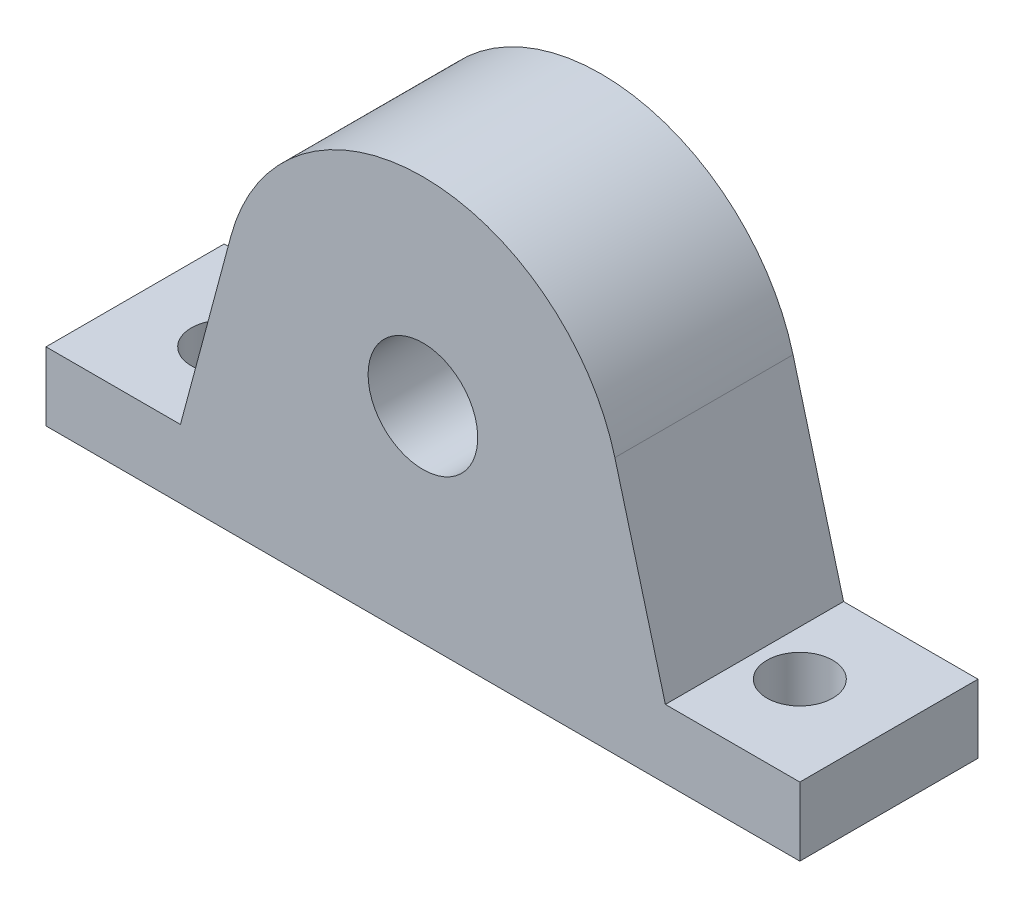
ISO-10303-21;
HEADER;
FILE_DESCRIPTION(('STEP AP214'),'2;1');
FILE_NAME('part.step','',(''),(''),'','','');
FILE_SCHEMA(('AUTOMOTIVE_DESIGN { 1 0 10303 214 1 1 1 1 }'));
ENDSEC;
DATA;
#1=APPLICATION_CONTEXT('core data for automotive mechanical design processes');
#2=APPLICATION_PROTOCOL_DEFINITION('international standard','automotive_design',2000,#1);
#3=PRODUCT_CONTEXT('',#1,'mechanical');
#4=PRODUCT('Part','Part','',(#3));
#5=PRODUCT_RELATED_PRODUCT_CATEGORY('part','',(#4));
#6=PRODUCT_DEFINITION_FORMATION('','',#4);
#7=PRODUCT_DEFINITION_CONTEXT('part definition',#1,'design');
#8=PRODUCT_DEFINITION('design','',#6,#7);
#9=PRODUCT_DEFINITION_SHAPE('','',#8);
#10=(LENGTH_UNIT() NAMED_UNIT(*) SI_UNIT(.MILLI.,.METRE.));
#11=(NAMED_UNIT(*) PLANE_ANGLE_UNIT() SI_UNIT($,.RADIAN.));
#12=(NAMED_UNIT(*) SI_UNIT($,.STERADIAN.) SOLID_ANGLE_UNIT());
#13=UNCERTAINTY_MEASURE_WITH_UNIT(LENGTH_MEASURE(1.E-05),#10,'distance_accuracy_value','');
#14=(GEOMETRIC_REPRESENTATION_CONTEXT(3) GLOBAL_UNCERTAINTY_ASSIGNED_CONTEXT((#13)) GLOBAL_UNIT_ASSIGNED_CONTEXT((#10,
#11,#12)) REPRESENTATION_CONTEXT('',''));
#15=CARTESIAN_POINT('',(0.,0.,0.));
#16=DIRECTION('',(0.,0.,1.));
#17=DIRECTION('',(1.,0.,0.));
#18=AXIS2_PLACEMENT_3D('',#15,#16,#17);
#19=CARTESIAN_POINT('',(0.,15.,6.5));
#20=DIRECTION('',(0.,0.,1.));
#21=DIRECTION('',(1.,0.,0.));
#22=AXIS2_PLACEMENT_3D('',#19,#20,#21);
#23=PLANE('',#22);
#24=DIRECTION('',(0.,-1.,0.));
#25=VECTOR('',#24,1.);
#26=CARTESIAN_POINT('',(-27.5,5.,6.5));
#27=LINE('',#26,#25);
#28=CARTESIAN_POINT('',(-27.5,5.,6.5));
#29=VERTEX_POINT('',#28);
#30=CARTESIAN_POINT('',(-27.5,0.,6.5));
#31=VERTEX_POINT('',#30);
#32=EDGE_CURVE('E152',#29,#31,#27,.T.);
#33=ORIENTED_EDGE('',*,*,#32,.T.);
#34=DIRECTION('',(1.,0.,0.));
#35=VECTOR('',#34,1.);
#36=CARTESIAN_POINT('',(-27.5,0.,6.5));
#37=LINE('',#36,#35);
#38=CARTESIAN_POINT('',(27.5,0.,6.5));
#39=VERTEX_POINT('',#38);
#40=EDGE_CURVE('E100',#31,#39,#37,.T.);
#41=ORIENTED_EDGE('',*,*,#40,.T.);
#42=DIRECTION('',(0.,1.,0.));
#43=VECTOR('',#42,1.);
#44=CARTESIAN_POINT('',(27.5,0.,6.5));
#45=LINE('',#44,#43);
#46=CARTESIAN_POINT('',(27.5,5.00000000000001,6.5));
#47=VERTEX_POINT('',#46);
#48=EDGE_CURVE('E167',#39,#47,#45,.T.);
#49=ORIENTED_EDGE('',*,*,#48,.T.);
#50=DIRECTION('',(-1.,0.,0.));
#51=VECTOR('',#50,1.);
#52=CARTESIAN_POINT('',(27.5,5.00000000000001,6.5));
#53=LINE('',#52,#51);
#54=CARTESIAN_POINT('',(17.6909965402574,5.,6.5));
#55=VERTEX_POINT('',#54);
#56=EDGE_CURVE('E180',#47,#55,#53,.T.);
#57=ORIENTED_EDGE('',*,*,#56,.T.);
#58=DIRECTION('',(-0.258819045102521,0.965925826289068,0.));
#59=VECTOR('',#58,1.);
#60=CARTESIAN_POINT('',(14.0059244811915,18.7528761539866,6.5));
#61=LINE('',#60,#59);
#62=CARTESIAN_POINT('',(14.0059244811915,18.7528761539866,6.5));
#63=VERTEX_POINT('',#62);
#64=EDGE_CURVE('E119',#55,#63,#61,.T.);
#65=ORIENTED_EDGE('',*,*,#64,.T.);
#66=CARTESIAN_POINT('',(0.,15.,6.5));
#67=DIRECTION('',(0.,0.,1.));
#68=DIRECTION('',(1.,0.,0.));
#69=AXIS2_PLACEMENT_3D('',#66,#67,#68);
#70=CIRCLE('',#69,14.5);
#71=CARTESIAN_POINT('',(-14.0059244811915,18.7528761539866,6.5));
#72=VERTEX_POINT('',#71);
#73=EDGE_CURVE('E113',#63,#72,#70,.T.);
#74=ORIENTED_EDGE('',*,*,#73,.T.);
#75=DIRECTION('',(-0.258819045102521,-0.965925826289068,0.));
#76=VECTOR('',#75,1.);
#77=CARTESIAN_POINT('',(-14.0059244811915,18.7528761539866,6.5));
#78=LINE('',#77,#76);
#79=CARTESIAN_POINT('',(-17.6909965402574,5.,6.5));
#80=VERTEX_POINT('',#79);
#81=EDGE_CURVE('E117',#72,#80,#78,.T.);
#82=ORIENTED_EDGE('',*,*,#81,.T.);
#83=DIRECTION('',(-1.,0.,0.));
#84=VECTOR('',#83,1.);
#85=CARTESIAN_POINT('',(-17.6909965402574,5.,6.5));
#86=LINE('',#85,#84);
#87=EDGE_CURVE('E57',#80,#29,#86,.T.);
#88=ORIENTED_EDGE('',*,*,#87,.T.);
#89=EDGE_LOOP('',(#33,#41,#49,#57,#65,#74,#82,#88));
#90=FACE_BOUND('',#89,.T.);
#91=CARTESIAN_POINT('',(0.,15.,6.5));
#92=DIRECTION('',(0.,0.,1.));
#93=DIRECTION('',(1.,0.,0.));
#94=AXIS2_PLACEMENT_3D('',#91,#92,#93);
#95=CIRCLE('',#94,4.);
#96=CARTESIAN_POINT('',(-4.,15.,6.5));
#97=VERTEX_POINT('',#96);
#98=EDGE_CURVE('E141',#97,#97,#95,.T.);
#99=ORIENTED_EDGE('',*,*,#98,.F.);
#100=EDGE_LOOP('',(#99));
#101=FACE_BOUND('',#100,.T.);
#102=ADVANCED_FACE('F40',(#90,#101),#23,.T.);
#103=CARTESIAN_POINT('',(0.,15.,-6.5));
#104=DIRECTION('',(0.,0.,1.));
#105=DIRECTION('',(1.,0.,0.));
#106=AXIS2_PLACEMENT_3D('',#103,#104,#105);
#107=PLANE('',#106);
#108=DIRECTION('',(0.,-1.,0.));
#109=VECTOR('',#108,1.);
#110=CARTESIAN_POINT('',(-27.5,5.,-6.5));
#111=LINE('',#110,#109);
#112=CARTESIAN_POINT('',(-27.5,5.,-6.5));
#113=VERTEX_POINT('',#112);
#114=CARTESIAN_POINT('',(-27.5,0.,-6.5));
#115=VERTEX_POINT('',#114);
#116=EDGE_CURVE('E137',#113,#115,#111,.T.);
#117=ORIENTED_EDGE('',*,*,#116,.F.);
#118=DIRECTION('',(-1.,0.,0.));
#119=VECTOR('',#118,1.);
#120=CARTESIAN_POINT('',(-17.6909965402574,5.,-6.5));
#121=LINE('',#120,#119);
#122=CARTESIAN_POINT('',(-17.6909965402574,5.,-6.5));
#123=VERTEX_POINT('',#122);
#124=EDGE_CURVE('E92',#123,#113,#121,.T.);
#125=ORIENTED_EDGE('',*,*,#124,.F.);
#126=DIRECTION('',(-0.258819045102521,-0.965925826289068,0.));
#127=VECTOR('',#126,1.);
#128=CARTESIAN_POINT('',(-14.0059244811915,18.7528761539866,-6.5));
#129=LINE('',#128,#127);
#130=CARTESIAN_POINT('',(-14.0059244811915,18.7528761539866,-6.5));
#131=VERTEX_POINT('',#130);
#132=EDGE_CURVE('E86',#131,#123,#129,.T.);
#133=ORIENTED_EDGE('',*,*,#132,.F.);
#134=CARTESIAN_POINT('',(0.,15.,-6.5));
#135=DIRECTION('',(0.,0.,1.));
#136=DIRECTION('',(1.,0.,0.));
#137=AXIS2_PLACEMENT_3D('',#134,#135,#136);
#138=CIRCLE('',#137,14.5);
#139=CARTESIAN_POINT('',(14.0059244811915,18.7528761539866,-6.5));
#140=VERTEX_POINT('',#139);
#141=EDGE_CURVE('E127',#140,#131,#138,.T.);
#142=ORIENTED_EDGE('',*,*,#141,.F.);
#143=DIRECTION('',(-0.258819045102521,0.965925826289068,0.));
#144=VECTOR('',#143,1.);
#145=CARTESIAN_POINT('',(14.0059244811915,18.7528761539866,-6.5));
#146=LINE('',#145,#144);
#147=CARTESIAN_POINT('',(17.6909965402574,5.,-6.5));
#148=VERTEX_POINT('',#147);
#149=EDGE_CURVE('E147',#148,#140,#146,.T.);
#150=ORIENTED_EDGE('',*,*,#149,.F.);
#151=DIRECTION('',(-1.,0.,0.));
#152=VECTOR('',#151,1.);
#153=CARTESIAN_POINT('',(27.5,5.00000000000001,-6.5));
#154=LINE('',#153,#152);
#155=CARTESIAN_POINT('',(27.5,5.00000000000001,-6.5));
#156=VERTEX_POINT('',#155);
#157=EDGE_CURVE('E145',#156,#148,#154,.T.);
#158=ORIENTED_EDGE('',*,*,#157,.F.);
#159=DIRECTION('',(0.,1.,0.));
#160=VECTOR('',#159,1.);
#161=CARTESIAN_POINT('',(27.5,0.,-6.5));
#162=LINE('',#161,#160);
#163=CARTESIAN_POINT('',(27.5,0.,-6.5));
#164=VERTEX_POINT('',#163);
#165=EDGE_CURVE('E143',#164,#156,#162,.T.);
#166=ORIENTED_EDGE('',*,*,#165,.F.);
#167=DIRECTION('',(1.,0.,0.));
#168=VECTOR('',#167,1.);
#169=CARTESIAN_POINT('',(-27.5,0.,-6.5));
#170=LINE('',#169,#168);
#171=EDGE_CURVE('E140',#115,#164,#170,.T.);
#172=ORIENTED_EDGE('',*,*,#171,.F.);
#173=EDGE_LOOP('',(#117,#125,#133,#142,#150,#158,#166,#172));
#174=FACE_BOUND('',#173,.T.);
#175=CARTESIAN_POINT('',(0.,15.,-6.5));
#176=DIRECTION('',(0.,0.,1.));
#177=DIRECTION('',(1.,0.,0.));
#178=AXIS2_PLACEMENT_3D('',#175,#176,#177);
#179=CIRCLE('',#178,4.);
#180=CARTESIAN_POINT('',(-4.,15.,-6.5));
#181=VERTEX_POINT('',#180);
#182=EDGE_CURVE('E186',#181,#181,#179,.T.);
#183=ORIENTED_EDGE('',*,*,#182,.T.);
#184=EDGE_LOOP('',(#183));
#185=FACE_BOUND('',#184,.T.);
#186=ADVANCED_FACE('F171',(#174,#185),#107,.F.);
#187=CARTESIAN_POINT('',(-27.5,5.,6.5));
#188=DIRECTION('',(1.,0.,0.));
#189=DIRECTION('',(0.,0.,-1.));
#190=AXIS2_PLACEMENT_3D('',#187,#188,#189);
#191=PLANE('',#190);
#192=ORIENTED_EDGE('',*,*,#116,.T.);
#193=DIRECTION('',(0.,0.,-1.));
#194=VECTOR('',#193,1.);
#195=CARTESIAN_POINT('',(-27.5,0.,6.5));
#196=LINE('',#195,#194);
#197=EDGE_CURVE('E11',#31,#115,#196,.T.);
#198=ORIENTED_EDGE('',*,*,#197,.F.);
#199=ORIENTED_EDGE('',*,*,#32,.F.);
#200=DIRECTION('',(0.,0.,-1.));
#201=VECTOR('',#200,1.);
#202=CARTESIAN_POINT('',(-27.5,5.,6.5));
#203=LINE('',#202,#201);
#204=EDGE_CURVE('E133',#29,#113,#203,.T.);
#205=ORIENTED_EDGE('',*,*,#204,.T.);
#206=EDGE_LOOP('',(#192,#198,#199,#205));
#207=FACE_BOUND('',#206,.T.);
#208=ADVANCED_FACE('F42',(#207),#191,.F.);
#209=CARTESIAN_POINT('',(-27.5,0.,6.5));
#210=DIRECTION('',(0.,1.,0.));
#211=DIRECTION('',(-1.,0.,0.));
#212=AXIS2_PLACEMENT_3D('',#209,#210,#211);
#213=PLANE('',#212);
#214=CARTESIAN_POINT('',(-21.,0.,0.));
#215=DIRECTION('',(0.,1.,0.));
#216=DIRECTION('',(-1.,0.,0.));
#217=AXIS2_PLACEMENT_3D('',#214,#215,#216);
#218=CIRCLE('',#217,2.4);
#219=CARTESIAN_POINT('',(-23.4,0.,0.));
#220=VERTEX_POINT('',#219);
#221=EDGE_CURVE('E194',#220,#220,#218,.T.);
#222=ORIENTED_EDGE('',*,*,#221,.T.);
#223=EDGE_LOOP('',(#222));
#224=FACE_BOUND('',#223,.T.);
#225=CARTESIAN_POINT('',(21.,0.,0.));
#226=DIRECTION('',(0.,1.,0.));
#227=DIRECTION('',(-1.,0.,0.));
#228=AXIS2_PLACEMENT_3D('',#225,#226,#227);
#229=CIRCLE('',#228,2.4);
#230=CARTESIAN_POINT('',(18.6,0.,0.));
#231=VERTEX_POINT('',#230);
#232=EDGE_CURVE('E189',#231,#231,#229,.T.);
#233=ORIENTED_EDGE('',*,*,#232,.T.);
#234=EDGE_LOOP('',(#233));
#235=FACE_BOUND('',#234,.T.);
#236=ORIENTED_EDGE('',*,*,#171,.T.);
#237=DIRECTION('',(0.,0.,-1.));
#238=VECTOR('',#237,1.);
#239=CARTESIAN_POINT('',(27.5,0.,6.5));
#240=LINE('',#239,#238);
#241=EDGE_CURVE('E49',#39,#164,#240,.T.);
#242=ORIENTED_EDGE('',*,*,#241,.F.);
#243=ORIENTED_EDGE('',*,*,#40,.F.);
#244=ORIENTED_EDGE('',*,*,#197,.T.);
#245=EDGE_LOOP('',(#236,#242,#243,#244));
#246=FACE_BOUND('',#245,.T.);
#247=ADVANCED_FACE('F303',(#224,#235,#246),#213,.F.);
#248=CARTESIAN_POINT('',(27.5,0.,6.5));
#249=DIRECTION('',(-1.,0.,0.));
#250=DIRECTION('',(0.,0.,1.));
#251=AXIS2_PLACEMENT_3D('',#248,#249,#250);
#252=PLANE('',#251);
#253=ORIENTED_EDGE('',*,*,#165,.T.);
#254=DIRECTION('',(0.,0.,-1.));
#255=VECTOR('',#254,1.);
#256=CARTESIAN_POINT('',(27.5,5.00000000000001,6.5));
#257=LINE('',#256,#255);
#258=EDGE_CURVE('E159',#47,#156,#257,.T.);
#259=ORIENTED_EDGE('',*,*,#258,.F.);
#260=ORIENTED_EDGE('',*,*,#48,.F.);
#261=ORIENTED_EDGE('',*,*,#241,.T.);
#262=EDGE_LOOP('',(#253,#259,#260,#261));
#263=FACE_BOUND('',#262,.T.);
#264=ADVANCED_FACE('F165',(#263),#252,.F.);
#265=CARTESIAN_POINT('',(27.5,5.00000000000001,6.5));
#266=DIRECTION('',(0.,-1.,0.));
#267=DIRECTION('',(1.,0.,0.));
#268=AXIS2_PLACEMENT_3D('',#265,#266,#267);
#269=PLANE('',#268);
#270=CARTESIAN_POINT('',(21.,5.00000000000002,0.));
#271=DIRECTION('',(0.,1.,0.));
#272=DIRECTION('',(1.,0.,0.));
#273=AXIS2_PLACEMENT_3D('',#270,#271,#272);
#274=CIRCLE('',#273,2.4);
#275=CARTESIAN_POINT('',(18.6,5.00000000000002,0.));
#276=VERTEX_POINT('',#275);
#277=EDGE_CURVE('E198',#276,#276,#274,.T.);
#278=ORIENTED_EDGE('',*,*,#277,.F.);
#279=EDGE_LOOP('',(#278));
#280=FACE_BOUND('',#279,.T.);
#281=ORIENTED_EDGE('',*,*,#157,.T.);
#282=DIRECTION('',(0.,0.,-1.));
#283=VECTOR('',#282,1.);
#284=CARTESIAN_POINT('',(17.6909965402574,5.,6.5));
#285=LINE('',#284,#283);
#286=EDGE_CURVE('E156',#55,#148,#285,.T.);
#287=ORIENTED_EDGE('',*,*,#286,.F.);
#288=ORIENTED_EDGE('',*,*,#56,.F.);
#289=ORIENTED_EDGE('',*,*,#258,.T.);
#290=EDGE_LOOP('',(#281,#287,#288,#289));
#291=FACE_BOUND('',#290,.T.);
#292=ADVANCED_FACE('F176',(#280,#291),#269,.F.);
#293=CARTESIAN_POINT('',(14.0059244811915,18.7528761539866,6.5));
#294=DIRECTION('',(-0.965925826289068,-0.258819045102521,0.));
#295=DIRECTION('',(0.258819045102521,-0.965925826289068,0.));
#296=AXIS2_PLACEMENT_3D('',#293,#294,#295);
#297=PLANE('',#296);
#298=ORIENTED_EDGE('',*,*,#149,.T.);
#299=DIRECTION('',(0.,0.,-1.));
#300=VECTOR('',#299,1.);
#301=CARTESIAN_POINT('',(14.0059244811915,18.7528761539866,6.5));
#302=LINE('',#301,#300);
#303=EDGE_CURVE('E128',#63,#140,#302,.T.);
#304=ORIENTED_EDGE('',*,*,#303,.F.);
#305=ORIENTED_EDGE('',*,*,#64,.F.);
#306=ORIENTED_EDGE('',*,*,#286,.T.);
#307=EDGE_LOOP('',(#298,#304,#305,#306));
#308=FACE_BOUND('',#307,.T.);
#309=ADVANCED_FACE('F179',(#308),#297,.F.);
#310=CARTESIAN_POINT('',(0.,15.,6.5));
#311=DIRECTION('',(0.,0.,-1.));
#312=DIRECTION('',(-1.,0.,0.));
#313=AXIS2_PLACEMENT_3D('',#310,#311,#312);
#314=CYLINDRICAL_SURFACE('',#313,14.5);
#315=ORIENTED_EDGE('',*,*,#141,.T.);
#316=DIRECTION('',(0.,0.,-1.));
#317=VECTOR('',#316,1.);
#318=CARTESIAN_POINT('',(-14.0059244811915,18.7528761539866,6.5));
#319=LINE('',#318,#317);
#320=EDGE_CURVE('E124',#72,#131,#319,.T.);
#321=ORIENTED_EDGE('',*,*,#320,.F.);
#322=ORIENTED_EDGE('',*,*,#73,.F.);
#323=ORIENTED_EDGE('',*,*,#303,.T.);
#324=EDGE_LOOP('',(#315,#321,#322,#323));
#325=FACE_BOUND('',#324,.T.);
#326=ADVANCED_FACE('F125',(#325),#314,.T.);
#327=CARTESIAN_POINT('',(-14.0059244811915,18.7528761539866,6.5));
#328=DIRECTION('',(0.965925826289068,-0.258819045102521,0.));
#329=DIRECTION('',(0.258819045102521,0.965925826289068,0.));
#330=AXIS2_PLACEMENT_3D('',#327,#328,#329);
#331=PLANE('',#330);
#332=ORIENTED_EDGE('',*,*,#132,.T.);
#333=DIRECTION('',(0.,0.,-1.));
#334=VECTOR('',#333,1.);
#335=CARTESIAN_POINT('',(-17.6909965402574,5.,6.5));
#336=LINE('',#335,#334);
#337=EDGE_CURVE('E129',#80,#123,#336,.T.);
#338=ORIENTED_EDGE('',*,*,#337,.F.);
#339=ORIENTED_EDGE('',*,*,#81,.F.);
#340=ORIENTED_EDGE('',*,*,#320,.T.);
#341=EDGE_LOOP('',(#332,#338,#339,#340));
#342=FACE_BOUND('',#341,.T.);
#343=ADVANCED_FACE('F131',(#342),#331,.F.);
#344=CARTESIAN_POINT('',(-17.6909965402574,5.,6.5));
#345=DIRECTION('',(0.,-1.,0.));
#346=DIRECTION('',(1.,0.,0.));
#347=AXIS2_PLACEMENT_3D('',#344,#345,#346);
#348=PLANE('',#347);
#349=CARTESIAN_POINT('',(-21.,5.,0.));
#350=DIRECTION('',(0.,1.,0.));
#351=DIRECTION('',(-1.,0.,0.));
#352=AXIS2_PLACEMENT_3D('',#349,#350,#351);
#353=CIRCLE('',#352,2.4);
#354=CARTESIAN_POINT('',(-23.4,5.,0.));
#355=VERTEX_POINT('',#354);
#356=EDGE_CURVE('E197',#355,#355,#353,.T.);
#357=ORIENTED_EDGE('',*,*,#356,.F.);
#358=EDGE_LOOP('',(#357));
#359=FACE_BOUND('',#358,.T.);
#360=ORIENTED_EDGE('',*,*,#124,.T.);
#361=ORIENTED_EDGE('',*,*,#204,.F.);
#362=ORIENTED_EDGE('',*,*,#87,.F.);
#363=ORIENTED_EDGE('',*,*,#337,.T.);
#364=EDGE_LOOP('',(#360,#361,#362,#363));
#365=FACE_BOUND('',#364,.T.);
#366=ADVANCED_FACE('F207',(#359,#365),#348,.F.);
#367=CARTESIAN_POINT('',(0.,15.,6.5));
#368=DIRECTION('',(0.,0.,-1.));
#369=DIRECTION('',(-1.,0.,0.));
#370=AXIS2_PLACEMENT_3D('',#367,#368,#369);
#371=CYLINDRICAL_SURFACE('',#370,4.);
#372=CARTESIAN_POINT('',(-4.,15.,6.5));
#373=CARTESIAN_POINT('',(-4.,15.,6.36458333333333));
#374=CARTESIAN_POINT('',(-4.,15.,6.22916666666667));
#375=CARTESIAN_POINT('',(-4.,15.,5.95833333333333));
#376=CARTESIAN_POINT('',(-4.,15.,5.82291666666667));
#377=CARTESIAN_POINT('',(-4.,15.,5.55208333333333));
#378=CARTESIAN_POINT('',(-4.,15.,5.41666666666667));
#379=CARTESIAN_POINT('',(-4.,15.,5.14583333333333));
#380=CARTESIAN_POINT('',(-4.,15.,5.01041666666667));
#381=CARTESIAN_POINT('',(-4.,15.,4.73958333333333));
#382=CARTESIAN_POINT('',(-4.,15.,4.60416666666667));
#383=CARTESIAN_POINT('',(-4.,15.,4.33333333333333));
#384=CARTESIAN_POINT('',(-4.,15.,4.19791666666667));
#385=CARTESIAN_POINT('',(-4.,15.,3.92708333333333));
#386=CARTESIAN_POINT('',(-4.,15.,3.79166666666667));
#387=CARTESIAN_POINT('',(-4.,15.,3.52083333333333));
#388=CARTESIAN_POINT('',(-4.,15.,3.38541666666667));
#389=CARTESIAN_POINT('',(-4.,15.,3.11458333333333));
#390=CARTESIAN_POINT('',(-4.,15.,2.97916666666667));
#391=CARTESIAN_POINT('',(-4.,15.,2.70833333333333));
#392=CARTESIAN_POINT('',(-4.,15.,2.57291666666667));
#393=CARTESIAN_POINT('',(-4.,15.,2.30208333333333));
#394=CARTESIAN_POINT('',(-4.,15.,2.16666666666667));
#395=CARTESIAN_POINT('',(-4.,15.,1.89583333333333));
#396=CARTESIAN_POINT('',(-4.,15.,1.76041666666667));
#397=CARTESIAN_POINT('',(-4.,15.,1.48958333333333));
#398=CARTESIAN_POINT('',(-4.,15.,1.35416666666667));
#399=CARTESIAN_POINT('',(-4.,15.,1.08333333333333));
#400=CARTESIAN_POINT('',(-4.,15.,0.947916666666666));
#401=CARTESIAN_POINT('',(-4.,15.,0.677083333333332));
#402=CARTESIAN_POINT('',(-4.,15.,0.541666666666666));
#403=CARTESIAN_POINT('',(-4.,15.,0.270833333333333));
#404=CARTESIAN_POINT('',(-4.,15.,0.135416666666666));
#405=CARTESIAN_POINT('',(-4.,15.,-0.135416666666668));
#406=CARTESIAN_POINT('',(-4.,15.,-0.270833333333334));
#407=CARTESIAN_POINT('',(-4.,15.,-0.541666666666668));
#408=CARTESIAN_POINT('',(-4.,15.,-0.677083333333334));
#409=CARTESIAN_POINT('',(-4.,15.,-0.947916666666667));
#410=CARTESIAN_POINT('',(-4.,15.,-1.08333333333333));
#411=CARTESIAN_POINT('',(-4.,15.,-1.35416666666667));
#412=CARTESIAN_POINT('',(-4.,15.,-1.48958333333333));
#413=CARTESIAN_POINT('',(-4.,15.,-1.76041666666667));
#414=CARTESIAN_POINT('',(-4.,15.,-1.89583333333333));
#415=CARTESIAN_POINT('',(-4.,15.,-2.16666666666667));
#416=CARTESIAN_POINT('',(-4.,15.,-2.30208333333333));
#417=CARTESIAN_POINT('',(-4.,15.,-2.57291666666667));
#418=CARTESIAN_POINT('',(-4.,15.,-2.70833333333333));
#419=CARTESIAN_POINT('',(-4.,15.,-2.97916666666667));
#420=CARTESIAN_POINT('',(-4.,15.,-3.11458333333333));
#421=CARTESIAN_POINT('',(-4.,15.,-3.38541666666667));
#422=CARTESIAN_POINT('',(-4.,15.,-3.52083333333333));
#423=CARTESIAN_POINT('',(-4.,15.,-3.79166666666667));
#424=CARTESIAN_POINT('',(-4.,15.,-3.92708333333333));
#425=CARTESIAN_POINT('',(-4.,15.,-4.19791666666667));
#426=CARTESIAN_POINT('',(-4.,15.,-4.33333333333333));
#427=CARTESIAN_POINT('',(-4.,15.,-4.60416666666667));
#428=CARTESIAN_POINT('',(-4.,15.,-4.73958333333333));
#429=CARTESIAN_POINT('',(-4.,15.,-5.01041666666667));
#430=CARTESIAN_POINT('',(-4.,15.,-5.14583333333333));
#431=CARTESIAN_POINT('',(-4.,15.,-5.41666666666667));
#432=CARTESIAN_POINT('',(-4.,15.,-5.55208333333333));
#433=CARTESIAN_POINT('',(-4.,15.,-5.82291666666667));
#434=CARTESIAN_POINT('',(-4.,15.,-5.95833333333333));
#435=CARTESIAN_POINT('',(-4.,15.,-6.22916666666667));
#436=CARTESIAN_POINT('',(-4.,15.,-6.36458333333333));
#437=CARTESIAN_POINT('',(-4.,15.,-6.5));
#438=B_SPLINE_CURVE_WITH_KNOTS('',3,(#372,#373,#374,#375,#376,#377,#378,#379,#380,#381,#382,
#383,#384,#385,#386,#387,#388,#389,#390,#391,#392,#393,#394,#395,#396,#397,#398,#399,#400,#401,
#402,#403,#404,#405,#406,#407,#408,#409,#410,#411,#412,#413,#414,#415,#416,#417,#418,#419,#420,
#421,#422,#423,#424,#425,#426,#427,#428,#429,#430,#431,#432,#433,#434,#435,#436,#437),
.UNSPECIFIED.,.F.,.F.,(4,2,2,2,2,2,2,2,2,2,2,2,2,2,2,2,2,2,2,2,2,2,2,2,2,2,2,2,2,2,2,2,4),(0.,
0.40625,0.8125,1.21875,1.625,2.03125,2.4375,2.84375,3.25,3.65625,4.0625,4.46875,4.875,5.28125,
5.6875,6.09375,6.5,6.90625,7.3125,7.71875,8.125,8.53125,8.9375,9.34375,9.75,10.15625,10.5625,
10.96875,11.375,11.78125,12.1875,12.59375,13.),.UNSPECIFIED.);
#439=EDGE_CURVE('BSEAM209',#97,#181,#438,.T.);
#440=ORIENTED_EDGE('',*,*,#98,.T.);
#441=ORIENTED_EDGE('',*,*,#182,.F.);
#442=ORIENTED_EDGE('',*,*,#439,.T.);
#443=ORIENTED_EDGE('',*,*,#439,.F.);
#444=EDGE_LOOP('',(#440,#442,#441,#443));
#445=FACE_BOUND('',#444,.T.);
#446=ADVANCED_FACE('F209',(#445),#371,.F.);
#447=CARTESIAN_POINT('',(-21.,-8.,0.));
#448=DIRECTION('',(0.,1.,0.));
#449=DIRECTION('',(-1.,0.,0.));
#450=AXIS2_PLACEMENT_3D('',#447,#448,#449);
#451=CYLINDRICAL_SURFACE('',#450,2.4);
#452=CARTESIAN_POINT('',(-23.4,5.,0.));
#453=CARTESIAN_POINT('',(-23.4,4.94791666666667,0.));
#454=CARTESIAN_POINT('',(-23.4,4.89583333333333,0.));
#455=CARTESIAN_POINT('',(-23.4,4.79166666666667,0.));
#456=CARTESIAN_POINT('',(-23.4,4.73958333333333,0.));
#457=CARTESIAN_POINT('',(-23.4,4.63541666666667,0.));
#458=CARTESIAN_POINT('',(-23.4,4.58333333333333,0.));
#459=CARTESIAN_POINT('',(-23.4,4.47916666666667,0.));
#460=CARTESIAN_POINT('',(-23.4,4.42708333333333,0.));
#461=CARTESIAN_POINT('',(-23.4,4.32291666666667,0.));
#462=CARTESIAN_POINT('',(-23.4,4.27083333333333,0.));
#463=CARTESIAN_POINT('',(-23.4,4.16666666666667,0.));
#464=CARTESIAN_POINT('',(-23.4,4.11458333333333,0.));
#465=CARTESIAN_POINT('',(-23.4,4.01041666666667,0.));
#466=CARTESIAN_POINT('',(-23.4,3.95833333333333,0.));
#467=CARTESIAN_POINT('',(-23.4,3.85416666666667,0.));
#468=CARTESIAN_POINT('',(-23.4,3.80208333333333,0.));
#469=CARTESIAN_POINT('',(-23.4,3.69791666666667,0.));
#470=CARTESIAN_POINT('',(-23.4,3.64583333333333,0.));
#471=CARTESIAN_POINT('',(-23.4,3.54166666666667,0.));
#472=CARTESIAN_POINT('',(-23.4,3.48958333333333,0.));
#473=CARTESIAN_POINT('',(-23.4,3.38541666666667,0.));
#474=CARTESIAN_POINT('',(-23.4,3.33333333333333,0.));
#475=CARTESIAN_POINT('',(-23.4,3.22916666666667,0.));
#476=CARTESIAN_POINT('',(-23.4,3.17708333333333,0.));
#477=CARTESIAN_POINT('',(-23.4,3.07291666666667,0.));
#478=CARTESIAN_POINT('',(-23.4,3.02083333333333,0.));
#479=CARTESIAN_POINT('',(-23.4,2.91666666666667,0.));
#480=CARTESIAN_POINT('',(-23.4,2.86458333333333,0.));
#481=CARTESIAN_POINT('',(-23.4,2.76041666666667,0.));
#482=CARTESIAN_POINT('',(-23.4,2.70833333333333,0.));
#483=CARTESIAN_POINT('',(-23.4,2.60416666666667,0.));
#484=CARTESIAN_POINT('',(-23.4,2.55208333333333,0.));
#485=CARTESIAN_POINT('',(-23.4,2.44791666666667,0.));
#486=CARTESIAN_POINT('',(-23.4,2.39583333333333,0.));
#487=CARTESIAN_POINT('',(-23.4,2.29166666666667,0.));
#488=CARTESIAN_POINT('',(-23.4,2.23958333333333,0.));
#489=CARTESIAN_POINT('',(-23.4,2.13541666666667,0.));
#490=CARTESIAN_POINT('',(-23.4,2.08333333333333,0.));
#491=CARTESIAN_POINT('',(-23.4,1.97916666666667,0.));
#492=CARTESIAN_POINT('',(-23.4,1.92708333333333,0.));
#493=CARTESIAN_POINT('',(-23.4,1.82291666666667,0.));
#494=CARTESIAN_POINT('',(-23.4,1.77083333333333,0.));
#495=CARTESIAN_POINT('',(-23.4,1.66666666666667,0.));
#496=CARTESIAN_POINT('',(-23.4,1.61458333333333,0.));
#497=CARTESIAN_POINT('',(-23.4,1.51041666666667,0.));
#498=CARTESIAN_POINT('',(-23.4,1.45833333333333,0.));
#499=CARTESIAN_POINT('',(-23.4,1.35416666666667,0.));
#500=CARTESIAN_POINT('',(-23.4,1.30208333333333,0.));
#501=CARTESIAN_POINT('',(-23.4,1.19791666666667,0.));
#502=CARTESIAN_POINT('',(-23.4,1.14583333333333,0.));
#503=CARTESIAN_POINT('',(-23.4,1.04166666666667,0.));
#504=CARTESIAN_POINT('',(-23.4,0.989583333333334,0.));
#505=CARTESIAN_POINT('',(-23.4,0.885416666666668,0.));
#506=CARTESIAN_POINT('',(-23.4,0.833333333333334,0.));
#507=CARTESIAN_POINT('',(-23.4,0.729166666666667,0.));
#508=CARTESIAN_POINT('',(-23.4,0.677083333333334,0.));
#509=CARTESIAN_POINT('',(-23.4,0.572916666666667,0.));
#510=CARTESIAN_POINT('',(-23.4,0.520833333333334,0.));
#511=CARTESIAN_POINT('',(-23.4,0.416666666666667,0.));
#512=CARTESIAN_POINT('',(-23.4,0.364583333333334,0.));
#513=CARTESIAN_POINT('',(-23.4,0.260416666666667,0.));
#514=CARTESIAN_POINT('',(-23.4,0.208333333333333,0.));
#515=CARTESIAN_POINT('',(-23.4,0.104166666666667,0.));
#516=CARTESIAN_POINT('',(-23.4,0.0520833333333334,0.));
#517=CARTESIAN_POINT('',(-23.4,0.,0.));
#518=B_SPLINE_CURVE_WITH_KNOTS('',3,(#452,#453,#454,#455,#456,#457,#458,#459,#460,#461,#462,
#463,#464,#465,#466,#467,#468,#469,#470,#471,#472,#473,#474,#475,#476,#477,#478,#479,#480,#481,
#482,#483,#484,#485,#486,#487,#488,#489,#490,#491,#492,#493,#494,#495,#496,#497,#498,#499,#500,
#501,#502,#503,#504,#505,#506,#507,#508,#509,#510,#511,#512,#513,#514,#515,#516,#517),
.UNSPECIFIED.,.F.,.F.,(4,2,2,2,2,2,2,2,2,2,2,2,2,2,2,2,2,2,2,2,2,2,2,2,2,2,2,2,2,2,2,2,4),(0.,
0.15625,0.3125,0.46875,0.625000000000001,0.781250000000001,0.937500000000001,1.09375,1.25,
1.40625,1.5625,1.71875,1.875,2.03125,2.1875,2.34375,2.5,2.65625,2.8125,2.96875,3.125,3.28125,
3.4375,3.59375,3.75,3.90625,4.0625,4.21875,4.375,4.53125,4.6875,4.84375,5.),.UNSPECIFIED.);
#519=EDGE_CURVE('BSEAM204',#355,#220,#518,.T.);
#520=ORIENTED_EDGE('',*,*,#356,.T.);
#521=ORIENTED_EDGE('',*,*,#221,.F.);
#522=ORIENTED_EDGE('',*,*,#519,.T.);
#523=ORIENTED_EDGE('',*,*,#519,.F.);
#524=EDGE_LOOP('',(#520,#522,#521,#523));
#525=FACE_BOUND('',#524,.T.);
#526=ADVANCED_FACE('F204',(#525),#451,.F.);
#527=CARTESIAN_POINT('',(21.,-7.99999999999998,0.));
#528=DIRECTION('',(0.,1.,0.));
#529=DIRECTION('',(-1.,0.,0.));
#530=AXIS2_PLACEMENT_3D('',#527,#528,#529);
#531=CYLINDRICAL_SURFACE('',#530,2.4);
#532=CARTESIAN_POINT('',(18.6,5.00000000000002,0.));
#533=CARTESIAN_POINT('',(18.6,4.94791666666669,0.));
#534=CARTESIAN_POINT('',(18.6,4.89583333333335,0.));
#535=CARTESIAN_POINT('',(18.6,4.79166666666669,0.));
#536=CARTESIAN_POINT('',(18.6,4.73958333333335,0.));
#537=CARTESIAN_POINT('',(18.6,4.63541666666669,0.));
#538=CARTESIAN_POINT('',(18.6,4.58333333333335,0.));
#539=CARTESIAN_POINT('',(18.6,4.47916666666668,0.));
#540=CARTESIAN_POINT('',(18.6,4.42708333333335,0.));
#541=CARTESIAN_POINT('',(18.6,4.32291666666668,0.));
#542=CARTESIAN_POINT('',(18.6,4.27083333333335,0.));
#543=CARTESIAN_POINT('',(18.6,4.16666666666668,0.));
#544=CARTESIAN_POINT('',(18.6,4.11458333333335,0.));
#545=CARTESIAN_POINT('',(18.6,4.01041666666668,0.));
#546=CARTESIAN_POINT('',(18.6,3.95833333333335,0.));
#547=CARTESIAN_POINT('',(18.6,3.85416666666668,0.));
#548=CARTESIAN_POINT('',(18.6,3.80208333333335,0.));
#549=CARTESIAN_POINT('',(18.6,3.69791666666668,0.));
#550=CARTESIAN_POINT('',(18.6,3.64583333333335,0.));
#551=CARTESIAN_POINT('',(18.6,3.54166666666668,0.));
#552=CARTESIAN_POINT('',(18.6,3.48958333333335,0.));
#553=CARTESIAN_POINT('',(18.6,3.38541666666668,0.));
#554=CARTESIAN_POINT('',(18.6,3.33333333333335,0.));
#555=CARTESIAN_POINT('',(18.6,3.22916666666668,0.));
#556=CARTESIAN_POINT('',(18.6,3.17708333333335,0.));
#557=CARTESIAN_POINT('',(18.6,3.07291666666668,0.));
#558=CARTESIAN_POINT('',(18.6,3.02083333333335,0.));
#559=CARTESIAN_POINT('',(18.6,2.91666666666668,0.));
#560=CARTESIAN_POINT('',(18.6,2.86458333333335,0.));
#561=CARTESIAN_POINT('',(18.6,2.76041666666668,0.));
#562=CARTESIAN_POINT('',(18.6,2.70833333333335,0.));
#563=CARTESIAN_POINT('',(18.6,2.60416666666668,0.));
#564=CARTESIAN_POINT('',(18.6,2.55208333333335,0.));
#565=CARTESIAN_POINT('',(18.6,2.44791666666668,0.));
#566=CARTESIAN_POINT('',(18.6,2.39583333333335,0.));
#567=CARTESIAN_POINT('',(18.6,2.29166666666668,0.));
#568=CARTESIAN_POINT('',(18.6,2.23958333333334,0.));
#569=CARTESIAN_POINT('',(18.6,2.13541666666668,0.));
#570=CARTESIAN_POINT('',(18.6,2.08333333333334,0.));
#571=CARTESIAN_POINT('',(18.6,1.97916666666668,0.));
#572=CARTESIAN_POINT('',(18.6,1.92708333333334,0.));
#573=CARTESIAN_POINT('',(18.6,1.82291666666668,0.));
#574=CARTESIAN_POINT('',(18.6,1.77083333333334,0.));
#575=CARTESIAN_POINT('',(18.6,1.66666666666668,0.));
#576=CARTESIAN_POINT('',(18.6,1.61458333333334,0.));
#577=CARTESIAN_POINT('',(18.6,1.51041666666668,0.));
#578=CARTESIAN_POINT('',(18.6,1.45833333333334,0.));
#579=CARTESIAN_POINT('',(18.6,1.35416666666668,0.));
#580=CARTESIAN_POINT('',(18.6,1.30208333333334,0.));
#581=CARTESIAN_POINT('',(18.6,1.19791666666668,0.));
#582=CARTESIAN_POINT('',(18.6,1.14583333333334,0.));
#583=CARTESIAN_POINT('',(18.6,1.04166666666668,0.));
#584=CARTESIAN_POINT('',(18.6,0.989583333333342,0.));
#585=CARTESIAN_POINT('',(18.6,0.885416666666674,0.));
#586=CARTESIAN_POINT('',(18.6,0.833333333333341,0.));
#587=CARTESIAN_POINT('',(18.6,0.729166666666674,0.));
#588=CARTESIAN_POINT('',(18.6,0.677083333333341,0.));
#589=CARTESIAN_POINT('',(18.6,0.572916666666674,0.));
#590=CARTESIAN_POINT('',(18.6,0.52083333333334,0.));
#591=CARTESIAN_POINT('',(18.6,0.416666666666672,0.));
#592=CARTESIAN_POINT('',(18.6,0.364583333333339,0.));
#593=CARTESIAN_POINT('',(18.6,0.260416666666672,0.));
#594=CARTESIAN_POINT('',(18.6,0.208333333333339,0.));
#595=CARTESIAN_POINT('',(18.6,0.104166666666672,0.));
#596=CARTESIAN_POINT('',(18.6,0.0520833333333386,0.));
#597=CARTESIAN_POINT('',(18.6,0.,0.));
#598=B_SPLINE_CURVE_WITH_KNOTS('',3,(#532,#533,#534,#535,#536,#537,#538,#539,#540,#541,#542,
#543,#544,#545,#546,#547,#548,#549,#550,#551,#552,#553,#554,#555,#556,#557,#558,#559,#560,#561,
#562,#563,#564,#565,#566,#567,#568,#569,#570,#571,#572,#573,#574,#575,#576,#577,#578,#579,#580,
#581,#582,#583,#584,#585,#586,#587,#588,#589,#590,#591,#592,#593,#594,#595,#596,#597),
.UNSPECIFIED.,.F.,.F.,(4,2,2,2,2,2,2,2,2,2,2,2,2,2,2,2,2,2,2,2,2,2,2,2,2,2,2,2,2,2,2,2,4),(0.,
0.15625,0.3125,0.468750000000002,0.625000000000002,0.781250000000002,0.937500000000003,1.09375,
1.25,1.40625,1.5625,1.71875,1.87500000000001,2.03125000000001,2.18750000000001,2.34375000000001,
2.50000000000001,2.65625000000001,2.81250000000001,2.96875000000001,3.12500000000001,
3.28125000000001,3.43750000000001,3.59375000000001,3.75000000000001,3.90625000000001,
4.06250000000001,4.21875000000001,4.37500000000001,4.53125000000001,4.68750000000001,
4.84375000000002,5.00000000000002),.UNSPECIFIED.);
#599=EDGE_CURVE('BSEAM225',#276,#231,#598,.T.);
#600=ORIENTED_EDGE('',*,*,#277,.T.);
#601=ORIENTED_EDGE('',*,*,#232,.F.);
#602=ORIENTED_EDGE('',*,*,#599,.T.);
#603=ORIENTED_EDGE('',*,*,#599,.F.);
#604=EDGE_LOOP('',(#600,#602,#601,#603));
#605=FACE_BOUND('',#604,.T.);
#606=ADVANCED_FACE('F225',(#605),#531,.F.);
#607=CLOSED_SHELL('',(#102,#186,#208,#247,#264,#292,#309,#326,#343,#366,#446,#526,#606));
#608=MANIFOLD_SOLID_BREP('B2',#607);
#609=ADVANCED_BREP_SHAPE_REPRESENTATION('',(#18,#608),#14);
#610=SHAPE_DEFINITION_REPRESENTATION(#9,#609);
ENDSEC;
END-ISO-10303-21;
